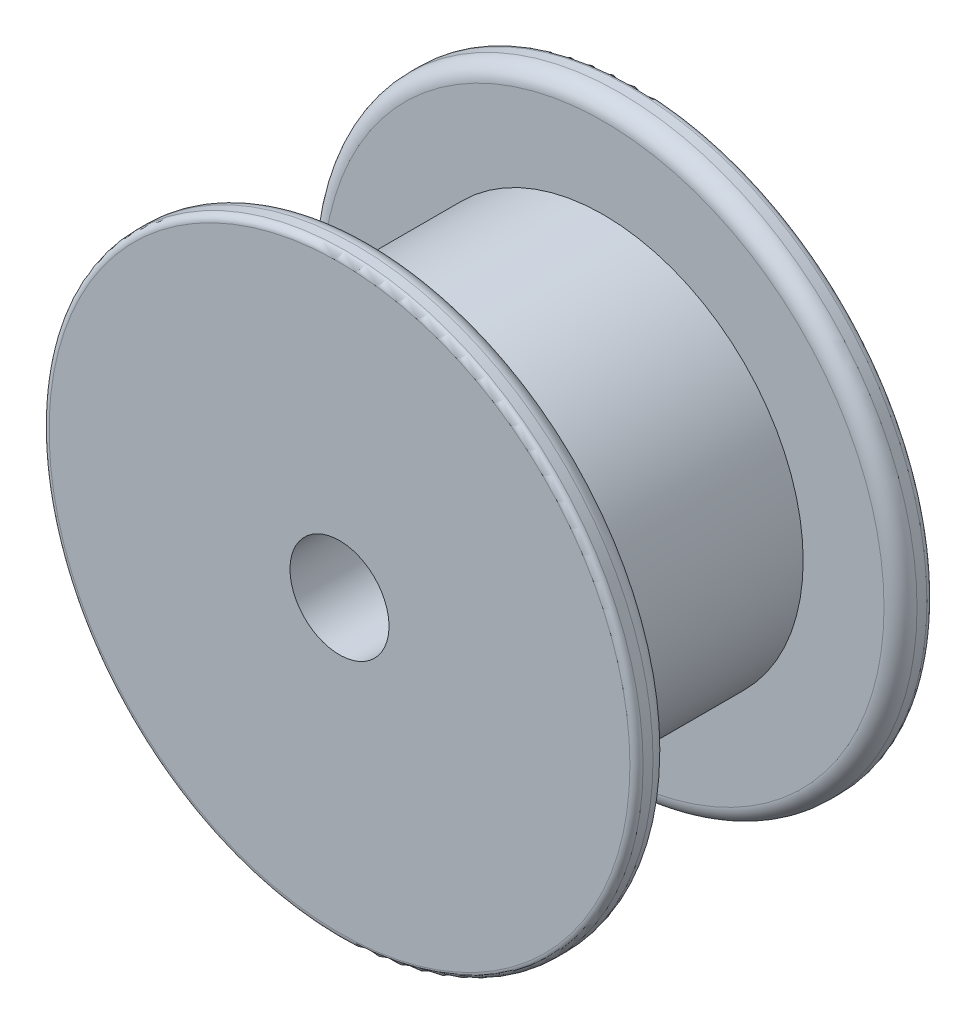
ISO-10303-21;
HEADER;
FILE_DESCRIPTION(('STEP AP214'),'2;1');
FILE_NAME('part.step','',(''),(''),'','','');
FILE_SCHEMA(('AUTOMOTIVE_DESIGN { 1 0 10303 214 1 1 1 1 }'));
ENDSEC;
DATA;
#1=APPLICATION_CONTEXT('core data for automotive mechanical design processes');
#2=APPLICATION_PROTOCOL_DEFINITION('international standard','automotive_design',2000,#1);
#3=PRODUCT_CONTEXT('',#1,'mechanical');
#4=PRODUCT('Part','Part','',(#3));
#5=PRODUCT_RELATED_PRODUCT_CATEGORY('part','',(#4));
#6=PRODUCT_DEFINITION_FORMATION('','',#4);
#7=PRODUCT_DEFINITION_CONTEXT('part definition',#1,'design');
#8=PRODUCT_DEFINITION('design','',#6,#7);
#9=PRODUCT_DEFINITION_SHAPE('','',#8);
#10=(LENGTH_UNIT() NAMED_UNIT(*) SI_UNIT(.MILLI.,.METRE.));
#11=(NAMED_UNIT(*) PLANE_ANGLE_UNIT() SI_UNIT($,.RADIAN.));
#12=(NAMED_UNIT(*) SI_UNIT($,.STERADIAN.) SOLID_ANGLE_UNIT());
#13=UNCERTAINTY_MEASURE_WITH_UNIT(LENGTH_MEASURE(1.E-05),#10,'distance_accuracy_value','');
#14=(GEOMETRIC_REPRESENTATION_CONTEXT(3) GLOBAL_UNCERTAINTY_ASSIGNED_CONTEXT((#13)) GLOBAL_UNIT_ASSIGNED_CONTEXT((#10,
#11,#12)) REPRESENTATION_CONTEXT('',''));
#15=CARTESIAN_POINT('',(0.,0.,0.));
#16=DIRECTION('',(0.,0.,1.));
#17=DIRECTION('',(1.,0.,0.));
#18=AXIS2_PLACEMENT_3D('',#15,#16,#17);
#19=CARTESIAN_POINT('',(69.6856354626537,5.69137084744963,7.));
#20=DIRECTION('',(0.,0.,-1.));
#21=DIRECTION('',(-1.,0.,0.));
#22=AXIS2_PLACEMENT_3D('',#19,#20,#21);
#23=CYLINDRICAL_SURFACE('',#22,6.05);
#24=CARTESIAN_POINT('',(69.6856354626537,5.69137084744963,7.));
#25=DIRECTION('',(0.,0.,1.));
#26=DIRECTION('',(1.,0.,0.));
#27=AXIS2_PLACEMENT_3D('',#24,#25,#26);
#28=CIRCLE('',#27,6.05);
#29=CARTESIAN_POINT('',(75.7356354626537,5.69137084744963,7.));
#30=VERTEX_POINT('',#29);
#31=EDGE_CURVE('E62',#30,#30,#28,.T.);
#32=ORIENTED_EDGE('',*,*,#31,.F.);
#33=EDGE_LOOP('',(#32));
#34=FACE_BOUND('',#33,.T.);
#35=CARTESIAN_POINT('',(69.6856354626537,5.69137084744963,0.));
#36=DIRECTION('',(0.,0.,1.));
#37=DIRECTION('',(1.,0.,0.));
#38=AXIS2_PLACEMENT_3D('',#35,#36,#37);
#39=CIRCLE('',#38,6.05);
#40=CARTESIAN_POINT('',(75.7356354626537,5.69137084744963,0.));
#41=VERTEX_POINT('',#40);
#42=EDGE_CURVE('E63',#41,#41,#39,.T.);
#43=ORIENTED_EDGE('',*,*,#42,.T.);
#44=EDGE_LOOP('',(#43));
#45=FACE_BOUND('',#44,.T.);
#46=ADVANCED_FACE('F30',(#34,#45),#23,.T.);
#47=CARTESIAN_POINT('',(69.6856354626537,5.69137084744963,8.));
#48=DIRECTION('',(0.,0.,-1.));
#49=DIRECTION('',(-1.,0.,0.));
#50=AXIS2_PLACEMENT_3D('',#47,#48,#49);
#51=CYLINDRICAL_SURFACE('',#50,9.);
#52=CARTESIAN_POINT('',(69.6856354626537,5.69137084744963,7.8));
#53=DIRECTION('',(0.,0.,1.));
#54=DIRECTION('',(1.,0.,0.));
#55=AXIS2_PLACEMENT_3D('',#52,#53,#54);
#56=CIRCLE('',#55,9.);
#57=CARTESIAN_POINT('',(78.6856354626537,5.69137084744963,7.8));
#58=VERTEX_POINT('',#57);
#59=EDGE_CURVE('E41',#58,#58,#56,.F.);
#60=ORIENTED_EDGE('',*,*,#59,.T.);
#61=EDGE_LOOP('',(#60));
#62=FACE_BOUND('',#61,.T.);
#63=CARTESIAN_POINT('',(69.6856354626537,5.69137084744963,7.5));
#64=DIRECTION('',(0.,0.,1.));
#65=DIRECTION('',(1.,0.,0.));
#66=AXIS2_PLACEMENT_3D('',#63,#64,#65);
#67=CIRCLE('',#66,9.);
#68=CARTESIAN_POINT('',(78.6856354626537,5.69137084744963,7.5));
#69=VERTEX_POINT('',#68);
#70=EDGE_CURVE('E53',#69,#69,#67,.T.);
#71=ORIENTED_EDGE('',*,*,#70,.T.);
#72=EDGE_LOOP('',(#71));
#73=FACE_BOUND('',#72,.T.);
#74=ADVANCED_FACE('F99',(#62,#73),#51,.T.);
#75=CARTESIAN_POINT('',(69.6856354626537,5.69137084744963,8.));
#76=DIRECTION('',(0.,0.,1.));
#77=DIRECTION('',(1.,0.,0.));
#78=AXIS2_PLACEMENT_3D('',#75,#76,#77);
#79=PLANE('',#78);
#80=CARTESIAN_POINT('',(69.6856354626537,5.69137084744963,8.));
#81=DIRECTION('',(0.,0.,-1.));
#82=DIRECTION('',(-1.,0.,0.));
#83=AXIS2_PLACEMENT_3D('',#80,#81,#82);
#84=CIRCLE('',#83,1.5);
#85=CARTESIAN_POINT('',(68.1856354626537,5.69137084744963,8.));
#86=VERTEX_POINT('',#85);
#87=EDGE_CURVE('E66',#86,#86,#84,.T.);
#88=ORIENTED_EDGE('',*,*,#87,.T.);
#89=EDGE_LOOP('',(#88));
#90=FACE_BOUND('',#89,.T.);
#91=CARTESIAN_POINT('',(69.6856354626537,5.69137084744963,8.));
#92=DIRECTION('',(0.,0.,1.));
#93=DIRECTION('',(1.,0.,0.));
#94=AXIS2_PLACEMENT_3D('',#91,#92,#93);
#95=CIRCLE('',#94,8.8);
#96=CARTESIAN_POINT('',(78.4856354626537,5.69137084744963,8.));
#97=VERTEX_POINT('',#96);
#98=EDGE_CURVE('E45',#97,#97,#95,.T.);
#99=ORIENTED_EDGE('',*,*,#98,.T.);
#100=EDGE_LOOP('',(#99));
#101=FACE_BOUND('',#100,.T.);
#102=ADVANCED_FACE('F75',(#90,#101),#79,.T.);
#103=CARTESIAN_POINT('',(69.6856354626537,5.69137084744963,7.));
#104=DIRECTION('',(0.,0.,1.));
#105=DIRECTION('',(1.,0.,0.));
#106=AXIS2_PLACEMENT_3D('',#103,#104,#105);
#107=PLANE('',#106);
#108=CARTESIAN_POINT('',(69.6856354626537,5.69137084744963,7.));
#109=DIRECTION('',(0.,0.,1.));
#110=DIRECTION('',(1.,0.,0.));
#111=AXIS2_PLACEMENT_3D('',#108,#109,#110);
#112=CIRCLE('',#111,8.49999999999999);
#113=CARTESIAN_POINT('',(78.1856354626537,5.69137084744963,7.));
#114=VERTEX_POINT('',#113);
#115=EDGE_CURVE('E50',#114,#114,#112,.F.);
#116=ORIENTED_EDGE('',*,*,#115,.T.);
#117=EDGE_LOOP('',(#116));
#118=FACE_BOUND('',#117,.T.);
#119=ORIENTED_EDGE('',*,*,#31,.T.);
#120=EDGE_LOOP('',(#119));
#121=FACE_BOUND('',#120,.T.);
#122=ADVANCED_FACE('F96',(#118,#121),#107,.F.);
#123=CARTESIAN_POINT('',(69.6856354626537,5.69137084744963,-1.));
#124=DIRECTION('',(0.,0.,1.));
#125=DIRECTION('',(1.,0.,0.));
#126=AXIS2_PLACEMENT_3D('',#123,#124,#125);
#127=CYLINDRICAL_SURFACE('',#126,9.);
#128=CARTESIAN_POINT('',(69.6856354626537,5.69137084744963,-0.8));
#129=DIRECTION('',(0.,0.,-1.));
#130=DIRECTION('',(-1.,0.,0.));
#131=AXIS2_PLACEMENT_3D('',#128,#129,#130);
#132=CIRCLE('',#131,9.);
#133=CARTESIAN_POINT('',(60.6856354626537,5.69137084744963,-0.8));
#134=VERTEX_POINT('',#133);
#135=EDGE_CURVE('E10',#134,#134,#132,.F.);
#136=ORIENTED_EDGE('',*,*,#135,.T.);
#137=EDGE_LOOP('',(#136));
#138=FACE_BOUND('',#137,.T.);
#139=CARTESIAN_POINT('',(69.6856354626537,5.69137084744963,-0.5));
#140=DIRECTION('',(0.,0.,-1.));
#141=DIRECTION('',(-1.,0.,0.));
#142=AXIS2_PLACEMENT_3D('',#139,#140,#141);
#143=CIRCLE('',#142,9.);
#144=CARTESIAN_POINT('',(60.6856354626537,5.69137084744963,-0.5));
#145=VERTEX_POINT('',#144);
#146=EDGE_CURVE('E59',#145,#145,#143,.T.);
#147=ORIENTED_EDGE('',*,*,#146,.T.);
#148=EDGE_LOOP('',(#147));
#149=FACE_BOUND('',#148,.T.);
#150=ADVANCED_FACE('F87',(#138,#149),#127,.T.);
#151=CARTESIAN_POINT('',(69.6856354626537,5.69137084744963,-1.));
#152=DIRECTION('',(0.,0.,-1.));
#153=DIRECTION('',(-1.,0.,0.));
#154=AXIS2_PLACEMENT_3D('',#151,#152,#153);
#155=PLANE('',#154);
#156=CARTESIAN_POINT('',(69.6856354626537,5.69137084744963,-1.));
#157=DIRECTION('',(0.,0.,-1.));
#158=DIRECTION('',(-1.,0.,0.));
#159=AXIS2_PLACEMENT_3D('',#156,#157,#158);
#160=CIRCLE('',#159,1.5);
#161=CARTESIAN_POINT('',(68.1856354626537,5.69137084744963,-1.));
#162=VERTEX_POINT('',#161);
#163=EDGE_CURVE('E69',#162,#162,#160,.T.);
#164=ORIENTED_EDGE('',*,*,#163,.F.);
#165=EDGE_LOOP('',(#164));
#166=FACE_BOUND('',#165,.T.);
#167=CARTESIAN_POINT('',(69.6856354626537,5.69137084744963,-1.));
#168=DIRECTION('',(0.,0.,-1.));
#169=DIRECTION('',(-1.,0.,0.));
#170=AXIS2_PLACEMENT_3D('',#167,#168,#169);
#171=CIRCLE('',#170,8.8);
#172=CARTESIAN_POINT('',(60.8856354626537,5.69137084744963,-1.));
#173=VERTEX_POINT('',#172);
#174=EDGE_CURVE('E37',#173,#173,#171,.T.);
#175=ORIENTED_EDGE('',*,*,#174,.T.);
#176=EDGE_LOOP('',(#175));
#177=FACE_BOUND('',#176,.T.);
#178=ADVANCED_FACE('F84',(#166,#177),#155,.T.);
#179=CARTESIAN_POINT('',(69.6856354626537,5.69137084744963,0.));
#180=DIRECTION('',(0.,0.,-1.));
#181=DIRECTION('',(-1.,0.,0.));
#182=AXIS2_PLACEMENT_3D('',#179,#180,#181);
#183=PLANE('',#182);
#184=CARTESIAN_POINT('',(69.6856354626537,5.69137084744963,0.));
#185=DIRECTION('',(0.,0.,-1.));
#186=DIRECTION('',(-1.,0.,0.));
#187=AXIS2_PLACEMENT_3D('',#184,#185,#186);
#188=CIRCLE('',#187,8.49999999999999);
#189=CARTESIAN_POINT('',(61.1856354626537,5.69137084744963,0.));
#190=VERTEX_POINT('',#189);
#191=EDGE_CURVE('E56',#190,#190,#188,.F.);
#192=ORIENTED_EDGE('',*,*,#191,.T.);
#193=EDGE_LOOP('',(#192));
#194=FACE_BOUND('',#193,.T.);
#195=ORIENTED_EDGE('',*,*,#42,.F.);
#196=EDGE_LOOP('',(#195));
#197=FACE_BOUND('',#196,.T.);
#198=ADVANCED_FACE('F86',(#194,#197),#183,.F.);
#199=CARTESIAN_POINT('',(69.6856354626537,5.69137084744963,-0.5));
#200=DIRECTION('',(0.,0.,-1.));
#201=DIRECTION('',(-1.,0.,0.));
#202=AXIS2_PLACEMENT_3D('',#199,#200,#201);
#203=TOROIDAL_SURFACE('',#202,8.49999999999999,0.5);
#204=ORIENTED_EDGE('',*,*,#191,.F.);
#205=EDGE_LOOP('',(#204));
#206=FACE_BOUND('',#205,.T.);
#207=ORIENTED_EDGE('',*,*,#146,.F.);
#208=EDGE_LOOP('',(#207));
#209=FACE_BOUND('',#208,.T.);
#210=ADVANCED_FACE('F93',(#206,#209),#203,.T.);
#211=CARTESIAN_POINT('',(69.6856354626537,5.69137084744963,7.5));
#212=DIRECTION('',(0.,0.,1.));
#213=DIRECTION('',(1.,0.,0.));
#214=AXIS2_PLACEMENT_3D('',#211,#212,#213);
#215=TOROIDAL_SURFACE('',#214,8.49999999999999,0.5);
#216=ORIENTED_EDGE('',*,*,#115,.F.);
#217=EDGE_LOOP('',(#216));
#218=FACE_BOUND('',#217,.T.);
#219=ORIENTED_EDGE('',*,*,#70,.F.);
#220=EDGE_LOOP('',(#219));
#221=FACE_BOUND('',#220,.T.);
#222=ADVANCED_FACE('F113',(#218,#221),#215,.T.);
#223=CARTESIAN_POINT('',(69.6856354626537,5.69137084744963,7.8));
#224=DIRECTION('',(0.,0.,1.));
#225=DIRECTION('',(1.,0.,0.));
#226=AXIS2_PLACEMENT_3D('',#223,#224,#225);
#227=TOROIDAL_SURFACE('',#226,8.8,0.2);
#228=ORIENTED_EDGE('',*,*,#59,.F.);
#229=EDGE_LOOP('',(#228));
#230=FACE_BOUND('',#229,.T.);
#231=ORIENTED_EDGE('',*,*,#98,.F.);
#232=EDGE_LOOP('',(#231));
#233=FACE_BOUND('',#232,.T.);
#234=ADVANCED_FACE('F116',(#230,#233),#227,.T.);
#235=CARTESIAN_POINT('',(69.6856354626537,5.69137084744963,-0.8));
#236=DIRECTION('',(0.,0.,-1.));
#237=DIRECTION('',(-1.,0.,0.));
#238=AXIS2_PLACEMENT_3D('',#235,#236,#237);
#239=TOROIDAL_SURFACE('',#238,8.8,0.2);
#240=ORIENTED_EDGE('',*,*,#135,.F.);
#241=EDGE_LOOP('',(#240));
#242=FACE_BOUND('',#241,.T.);
#243=ORIENTED_EDGE('',*,*,#174,.F.);
#244=EDGE_LOOP('',(#243));
#245=FACE_BOUND('',#244,.T.);
#246=ADVANCED_FACE('F32',(#242,#245),#239,.T.);
#247=CARTESIAN_POINT('',(69.6856354626537,5.69137084744963,8.));
#248=DIRECTION('',(0.,0.,-1.));
#249=DIRECTION('',(-1.,0.,0.));
#250=AXIS2_PLACEMENT_3D('',#247,#248,#249);
#251=CYLINDRICAL_SURFACE('',#250,1.5);
#252=ORIENTED_EDGE('',*,*,#87,.F.);
#253=EDGE_LOOP('',(#252));
#254=FACE_BOUND('',#253,.T.);
#255=ORIENTED_EDGE('',*,*,#163,.T.);
#256=EDGE_LOOP('',(#255));
#257=FACE_BOUND('',#256,.T.);
#258=ADVANCED_FACE('F78',(#254,#257),#251,.F.);
#259=CLOSED_SHELL('',(#46,#74,#102,#122,#150,#178,#198,#210,#222,#234,#246,#258));
#260=MANIFOLD_SOLID_BREP('B2',#259);
#261=ADVANCED_BREP_SHAPE_REPRESENTATION('',(#18,#260),#14);
#262=SHAPE_DEFINITION_REPRESENTATION(#9,#261);
ENDSEC;
END-ISO-10303-21;
